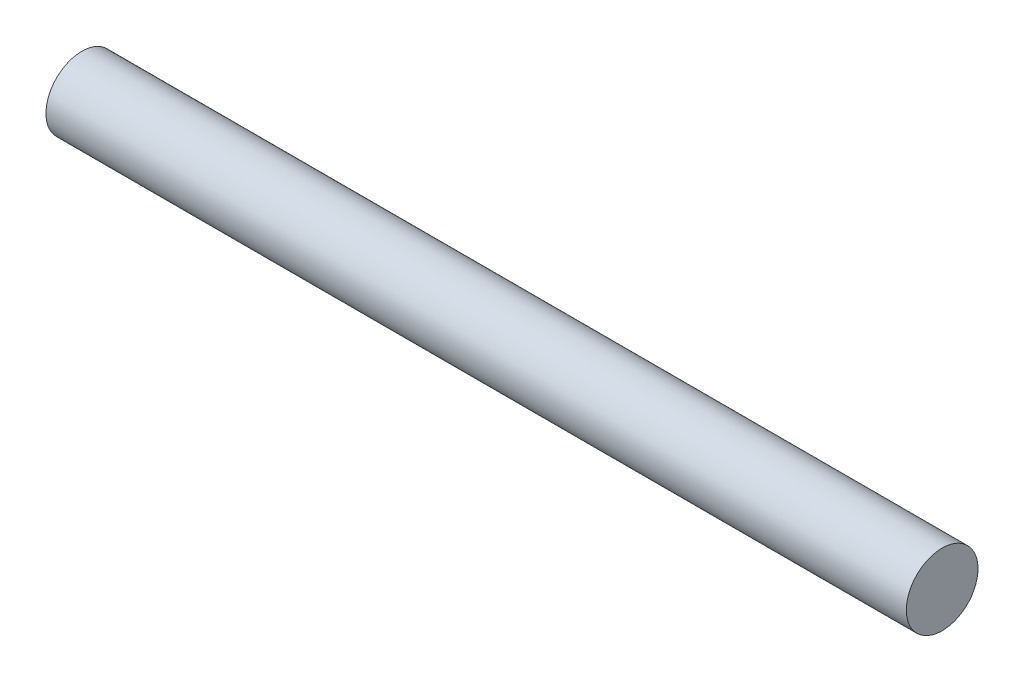
ISO-10303-21;
HEADER;
FILE_DESCRIPTION(('STEP AP214'),'2;1');
FILE_NAME('part.step','',(''),(''),'','','');
FILE_SCHEMA(('AUTOMOTIVE_DESIGN { 1 0 10303 214 1 1 1 1 }'));
ENDSEC;
DATA;
#1=APPLICATION_CONTEXT('core data for automotive mechanical design processes');
#2=APPLICATION_PROTOCOL_DEFINITION('international standard','automotive_design',2000,#1);
#3=PRODUCT_CONTEXT('',#1,'mechanical');
#4=PRODUCT('Part','Part','',(#3));
#5=PRODUCT_RELATED_PRODUCT_CATEGORY('part','',(#4));
#6=PRODUCT_DEFINITION_FORMATION('','',#4);
#7=PRODUCT_DEFINITION_CONTEXT('part definition',#1,'design');
#8=PRODUCT_DEFINITION('design','',#6,#7);
#9=PRODUCT_DEFINITION_SHAPE('','',#8);
#10=(LENGTH_UNIT() NAMED_UNIT(*) SI_UNIT(.MILLI.,.METRE.));
#11=(NAMED_UNIT(*) PLANE_ANGLE_UNIT() SI_UNIT($,.RADIAN.));
#12=(NAMED_UNIT(*) SI_UNIT($,.STERADIAN.) SOLID_ANGLE_UNIT());
#13=UNCERTAINTY_MEASURE_WITH_UNIT(LENGTH_MEASURE(1.E-05),#10,'distance_accuracy_value','');
#14=(GEOMETRIC_REPRESENTATION_CONTEXT(3) GLOBAL_UNCERTAINTY_ASSIGNED_CONTEXT((#13)) GLOBAL_UNIT_ASSIGNED_CONTEXT((#10,
#11,#12)) REPRESENTATION_CONTEXT('',''));
#15=CARTESIAN_POINT('',(0.,0.,0.));
#16=DIRECTION('',(0.,0.,1.));
#17=DIRECTION('',(1.,0.,0.));
#18=AXIS2_PLACEMENT_3D('',#15,#16,#17);
#19=CARTESIAN_POINT('',(300.,0.,0.));
#20=DIRECTION('',(-1.,0.,0.));
#21=DIRECTION('',(0.,0.,1.));
#22=AXIS2_PLACEMENT_3D('',#19,#20,#21);
#23=CYLINDRICAL_SURFACE('',#22,25.);
#24=CARTESIAN_POINT('',(300.,0.,0.));
#25=DIRECTION('',(1.,0.,0.));
#26=DIRECTION('',(0.,0.,-1.));
#27=AXIS2_PLACEMENT_3D('',#24,#25,#26);
#28=CIRCLE('',#27,25.);
#29=CARTESIAN_POINT('',(300.,0.,-25.));
#30=VERTEX_POINT('',#29);
#31=EDGE_CURVE('E10',#30,#30,#28,.T.);
#32=ORIENTED_EDGE('',*,*,#31,.F.);
#33=EDGE_LOOP('',(#32));
#34=FACE_BOUND('',#33,.T.);
#35=CARTESIAN_POINT('',(-300.,0.,0.));
#36=DIRECTION('',(1.,0.,0.));
#37=DIRECTION('',(0.,0.,-1.));
#38=AXIS2_PLACEMENT_3D('',#35,#36,#37);
#39=CIRCLE('',#38,25.);
#40=CARTESIAN_POINT('',(-300.,0.,-25.));
#41=VERTEX_POINT('',#40);
#42=EDGE_CURVE('E35',#41,#41,#39,.T.);
#43=ORIENTED_EDGE('',*,*,#42,.T.);
#44=EDGE_LOOP('',(#43));
#45=FACE_BOUND('',#44,.T.);
#46=ADVANCED_FACE('F32',(#34,#45),#23,.T.);
#47=CARTESIAN_POINT('',(300.,0.,0.));
#48=DIRECTION('',(1.,0.,0.));
#49=DIRECTION('',(0.,0.,-1.));
#50=AXIS2_PLACEMENT_3D('',#47,#48,#49);
#51=PLANE('',#50);
#52=ORIENTED_EDGE('',*,*,#31,.T.);
#53=EDGE_LOOP('',(#52));
#54=FACE_BOUND('',#53,.T.);
#55=ADVANCED_FACE('F47',(#54),#51,.T.);
#56=CARTESIAN_POINT('',(-300.,0.,0.));
#57=DIRECTION('',(1.,0.,0.));
#58=DIRECTION('',(0.,0.,-1.));
#59=AXIS2_PLACEMENT_3D('',#56,#57,#58);
#60=PLANE('',#59);
#61=ORIENTED_EDGE('',*,*,#42,.F.);
#62=EDGE_LOOP('',(#61));
#63=FACE_BOUND('',#62,.T.);
#64=ADVANCED_FACE('F45',(#63),#60,.F.);
#65=CLOSED_SHELL('',(#46,#55,#64));
#66=MANIFOLD_SOLID_BREP('B2',#65);
#67=ADVANCED_BREP_SHAPE_REPRESENTATION('',(#18,#66),#14);
#68=SHAPE_DEFINITION_REPRESENTATION(#9,#67);
ENDSEC;
END-ISO-10303-21;
